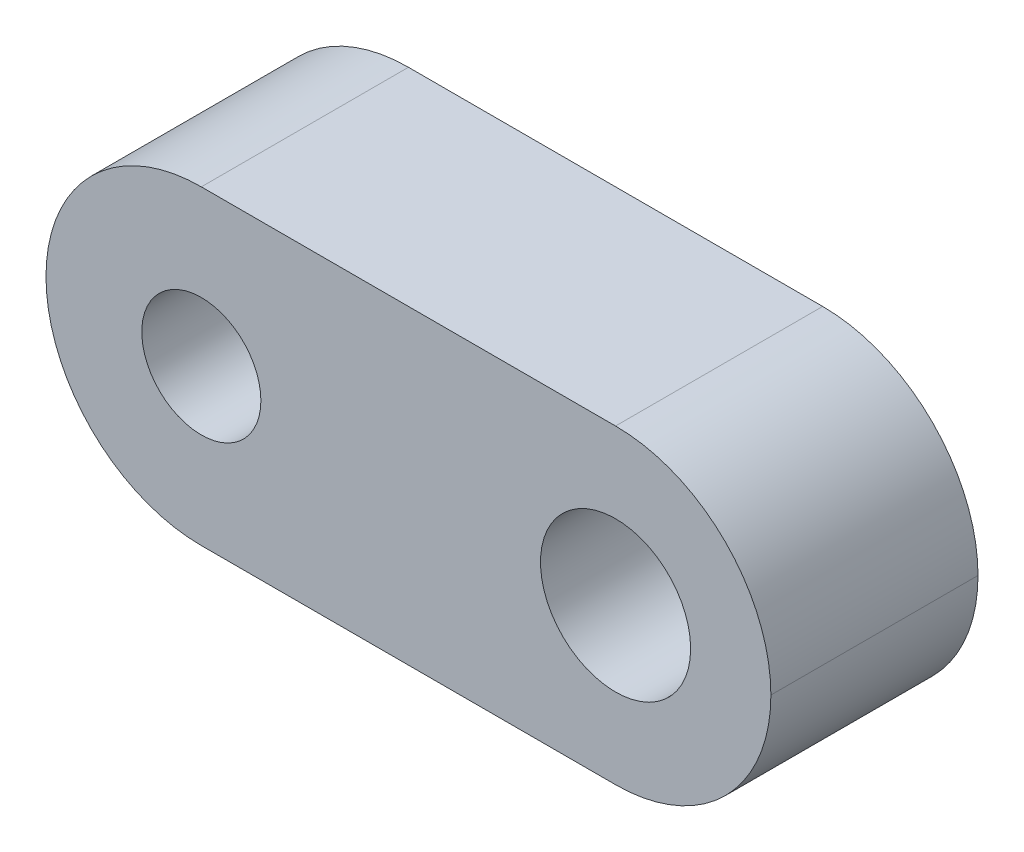
ISO-10303-21;
HEADER;
FILE_DESCRIPTION(('STEP AP214'),'2;1');
FILE_NAME('part.step','',(''),(''),'','','');
FILE_SCHEMA(('AUTOMOTIVE_DESIGN { 1 0 10303 214 1 1 1 1 }'));
ENDSEC;
DATA;
#1=APPLICATION_CONTEXT('core data for automotive mechanical design processes');
#2=APPLICATION_PROTOCOL_DEFINITION('international standard','automotive_design',2000,#1);
#3=PRODUCT_CONTEXT('',#1,'mechanical');
#4=PRODUCT('Part','Part','',(#3));
#5=PRODUCT_RELATED_PRODUCT_CATEGORY('part','',(#4));
#6=PRODUCT_DEFINITION_FORMATION('','',#4);
#7=PRODUCT_DEFINITION_CONTEXT('part definition',#1,'design');
#8=PRODUCT_DEFINITION('design','',#6,#7);
#9=PRODUCT_DEFINITION_SHAPE('','',#8);
#10=(LENGTH_UNIT() NAMED_UNIT(*) SI_UNIT(.MILLI.,.METRE.));
#11=(NAMED_UNIT(*) PLANE_ANGLE_UNIT() SI_UNIT($,.RADIAN.));
#12=(NAMED_UNIT(*) SI_UNIT($,.STERADIAN.) SOLID_ANGLE_UNIT());
#13=UNCERTAINTY_MEASURE_WITH_UNIT(LENGTH_MEASURE(1.E-05),#10,'distance_accuracy_value','');
#14=(GEOMETRIC_REPRESENTATION_CONTEXT(3) GLOBAL_UNCERTAINTY_ASSIGNED_CONTEXT((#13)) GLOBAL_UNIT_ASSIGNED_CONTEXT((#10,
#11,#12)) REPRESENTATION_CONTEXT('',''));
#15=CARTESIAN_POINT('',(0.,0.,0.));
#16=DIRECTION('',(0.,0.,1.));
#17=DIRECTION('',(1.,0.,0.));
#18=AXIS2_PLACEMENT_3D('',#15,#16,#17);
#19=CARTESIAN_POINT('',(0.,-6.,4.));
#20=DIRECTION('',(0.,1.,0.));
#21=DIRECTION('',(0.,0.,1.));
#22=AXIS2_PLACEMENT_3D('',#19,#20,#21);
#23=PLANE('',#22);
#24=DIRECTION('',(1.,0.,0.));
#25=VECTOR('',#24,1.);
#26=CARTESIAN_POINT('',(0.,-6.,0.));
#27=LINE('',#26,#25);
#28=CARTESIAN_POINT('',(3.,-6.,0.));
#29=VERTEX_POINT('',#28);
#30=CARTESIAN_POINT('',(11.,-6.,0.));
#31=VERTEX_POINT('',#30);
#32=EDGE_CURVE('E92',#29,#31,#27,.T.);
#33=ORIENTED_EDGE('',*,*,#32,.T.);
#34=DIRECTION('',(0.,0.,-1.));
#35=VECTOR('',#34,1.);
#36=CARTESIAN_POINT('',(11.,-6.,4.));
#37=LINE('',#36,#35);
#38=CARTESIAN_POINT('',(11.,-6.,4.));
#39=VERTEX_POINT('',#38);
#40=EDGE_CURVE('E124',#31,#39,#37,.F.);
#41=ORIENTED_EDGE('',*,*,#40,.T.);
#42=DIRECTION('',(1.,0.,0.));
#43=VECTOR('',#42,1.);
#44=CARTESIAN_POINT('',(0.,-6.,4.));
#45=LINE('',#44,#43);
#46=CARTESIAN_POINT('',(3.,-6.,4.));
#47=VERTEX_POINT('',#46);
#48=EDGE_CURVE('E134',#47,#39,#45,.T.);
#49=ORIENTED_EDGE('',*,*,#48,.F.);
#50=DIRECTION('',(0.,0.,-1.));
#51=VECTOR('',#50,1.);
#52=CARTESIAN_POINT('',(3.,-6.,4.));
#53=LINE('',#52,#51);
#54=EDGE_CURVE('E127',#47,#29,#53,.T.);
#55=ORIENTED_EDGE('',*,*,#54,.T.);
#56=EDGE_LOOP('',(#33,#41,#49,#55));
#57=FACE_BOUND('',#56,.T.);
#58=ADVANCED_FACE('F33',(#57),#23,.F.);
#59=CARTESIAN_POINT('',(0.,0.,4.));
#60=DIRECTION('',(0.,-1.,0.));
#61=DIRECTION('',(0.,0.,-1.));
#62=AXIS2_PLACEMENT_3D('',#59,#60,#61);
#63=PLANE('',#62);
#64=DIRECTION('',(-1.,0.,0.));
#65=VECTOR('',#64,1.);
#66=CARTESIAN_POINT('',(0.,0.,4.));
#67=LINE('',#66,#65);
#68=CARTESIAN_POINT('',(11.,0.,4.));
#69=VERTEX_POINT('',#68);
#70=CARTESIAN_POINT('',(3.,0.,4.));
#71=VERTEX_POINT('',#70);
#72=EDGE_CURVE('E103',#69,#71,#67,.T.);
#73=ORIENTED_EDGE('',*,*,#72,.F.);
#74=DIRECTION('',(0.,0.,-1.));
#75=VECTOR('',#74,1.);
#76=CARTESIAN_POINT('',(11.,0.,4.));
#77=LINE('',#76,#75);
#78=CARTESIAN_POINT('',(11.,0.,0.));
#79=VERTEX_POINT('',#78);
#80=EDGE_CURVE('E11',#69,#79,#77,.T.);
#81=ORIENTED_EDGE('',*,*,#80,.T.);
#82=DIRECTION('',(-1.,0.,0.));
#83=VECTOR('',#82,1.);
#84=CARTESIAN_POINT('',(0.,0.,0.));
#85=LINE('',#84,#83);
#86=CARTESIAN_POINT('',(3.,0.,0.));
#87=VERTEX_POINT('',#86);
#88=EDGE_CURVE('E132',#79,#87,#85,.T.);
#89=ORIENTED_EDGE('',*,*,#88,.T.);
#90=DIRECTION('',(0.,0.,-1.));
#91=VECTOR('',#90,1.);
#92=CARTESIAN_POINT('',(3.,0.,4.));
#93=LINE('',#92,#91);
#94=EDGE_CURVE('E42',#87,#71,#93,.F.);
#95=ORIENTED_EDGE('',*,*,#94,.T.);
#96=EDGE_LOOP('',(#73,#81,#89,#95));
#97=FACE_BOUND('',#96,.T.);
#98=ADVANCED_FACE('F154',(#97),#63,.F.);
#99=CARTESIAN_POINT('',(0.,0.,4.));
#100=DIRECTION('',(0.,0.,1.));
#101=DIRECTION('',(1.,0.,0.));
#102=AXIS2_PLACEMENT_3D('',#99,#100,#101);
#103=PLANE('',#102);
#104=CARTESIAN_POINT('',(11.,-3.,4.));
#105=DIRECTION('',(0.,0.,1.));
#106=DIRECTION('',(1.,0.,0.));
#107=AXIS2_PLACEMENT_3D('',#104,#105,#106);
#108=CIRCLE('',#107,1.45);
#109=CARTESIAN_POINT('',(12.45,-3.,4.));
#110=VERTEX_POINT('',#109);
#111=EDGE_CURVE('E114',#110,#110,#108,.T.);
#112=ORIENTED_EDGE('',*,*,#111,.F.);
#113=EDGE_LOOP('',(#112));
#114=FACE_BOUND('',#113,.T.);
#115=CARTESIAN_POINT('',(3.,-3.,4.));
#116=DIRECTION('',(0.,0.,1.));
#117=DIRECTION('',(1.,0.,0.));
#118=AXIS2_PLACEMENT_3D('',#115,#116,#117);
#119=CIRCLE('',#118,1.15);
#120=CARTESIAN_POINT('',(4.15,-3.,4.));
#121=VERTEX_POINT('',#120);
#122=EDGE_CURVE('E136',#121,#121,#119,.T.);
#123=ORIENTED_EDGE('',*,*,#122,.F.);
#124=EDGE_LOOP('',(#123));
#125=FACE_BOUND('',#124,.T.);
#126=ORIENTED_EDGE('',*,*,#48,.T.);
#127=CARTESIAN_POINT('',(11.,-3.,4.));
#128=DIRECTION('',(0.,0.,1.));
#129=DIRECTION('',(1.,0.,0.));
#130=AXIS2_PLACEMENT_3D('',#127,#128,#129);
#131=CIRCLE('',#130,3.);
#132=CARTESIAN_POINT('',(14.,-3.,4.));
#133=VERTEX_POINT('',#132);
#134=EDGE_CURVE('E118',#39,#133,#131,.T.);
#135=ORIENTED_EDGE('',*,*,#134,.T.);
#136=CARTESIAN_POINT('',(11.,-3.,4.));
#137=DIRECTION('',(0.,0.,1.));
#138=DIRECTION('',(1.,0.,0.));
#139=AXIS2_PLACEMENT_3D('',#136,#137,#138);
#140=CIRCLE('',#139,3.);
#141=EDGE_CURVE('E56',#133,#69,#140,.T.);
#142=ORIENTED_EDGE('',*,*,#141,.T.);
#143=ORIENTED_EDGE('',*,*,#72,.T.);
#144=CARTESIAN_POINT('',(3.,-3.,4.));
#145=DIRECTION('',(0.,0.,1.));
#146=DIRECTION('',(1.,0.,0.));
#147=AXIS2_PLACEMENT_3D('',#144,#145,#146);
#148=CIRCLE('',#147,3.);
#149=CARTESIAN_POINT('',(0.,-3.,4.));
#150=VERTEX_POINT('',#149);
#151=EDGE_CURVE('E122',#71,#150,#148,.T.);
#152=ORIENTED_EDGE('',*,*,#151,.T.);
#153=CARTESIAN_POINT('',(3.,-3.,4.));
#154=DIRECTION('',(0.,0.,1.));
#155=DIRECTION('',(1.,0.,0.));
#156=AXIS2_PLACEMENT_3D('',#153,#154,#155);
#157=CIRCLE('',#156,3.);
#158=EDGE_CURVE('E106',#150,#47,#157,.T.);
#159=ORIENTED_EDGE('',*,*,#158,.T.);
#160=EDGE_LOOP('',(#126,#135,#142,#143,#152,#159));
#161=FACE_BOUND('',#160,.T.);
#162=ADVANCED_FACE('F151',(#114,#125,#161),#103,.T.);
#163=CARTESIAN_POINT('',(0.,0.,0.));
#164=DIRECTION('',(0.,0.,1.));
#165=DIRECTION('',(1.,0.,0.));
#166=AXIS2_PLACEMENT_3D('',#163,#164,#165);
#167=PLANE('',#166);
#168=CARTESIAN_POINT('',(11.,-3.,0.));
#169=DIRECTION('',(0.,0.,1.));
#170=DIRECTION('',(1.,0.,0.));
#171=AXIS2_PLACEMENT_3D('',#168,#169,#170);
#172=CIRCLE('',#171,1.45);
#173=CARTESIAN_POINT('',(12.45,-3.,0.));
#174=VERTEX_POINT('',#173);
#175=EDGE_CURVE('E109',#174,#174,#172,.T.);
#176=ORIENTED_EDGE('',*,*,#175,.T.);
#177=EDGE_LOOP('',(#176));
#178=FACE_BOUND('',#177,.T.);
#179=CARTESIAN_POINT('',(3.,-3.,0.));
#180=DIRECTION('',(0.,0.,1.));
#181=DIRECTION('',(1.,0.,0.));
#182=AXIS2_PLACEMENT_3D('',#179,#180,#181);
#183=CIRCLE('',#182,1.15);
#184=CARTESIAN_POINT('',(4.15,-3.,0.));
#185=VERTEX_POINT('',#184);
#186=EDGE_CURVE('E142',#185,#185,#183,.T.);
#187=ORIENTED_EDGE('',*,*,#186,.T.);
#188=EDGE_LOOP('',(#187));
#189=FACE_BOUND('',#188,.T.);
#190=CARTESIAN_POINT('',(11.,-3.,0.));
#191=DIRECTION('',(0.,0.,1.));
#192=DIRECTION('',(1.,0.,0.));
#193=AXIS2_PLACEMENT_3D('',#190,#191,#192);
#194=CIRCLE('',#193,3.);
#195=CARTESIAN_POINT('',(14.,-3.,0.));
#196=VERTEX_POINT('',#195);
#197=EDGE_CURVE('E97',#79,#196,#194,.F.);
#198=ORIENTED_EDGE('',*,*,#197,.T.);
#199=CARTESIAN_POINT('',(11.,-3.,0.));
#200=DIRECTION('',(0.,0.,1.));
#201=DIRECTION('',(1.,0.,0.));
#202=AXIS2_PLACEMENT_3D('',#199,#200,#201);
#203=CIRCLE('',#202,3.);
#204=EDGE_CURVE('E129',#196,#31,#203,.F.);
#205=ORIENTED_EDGE('',*,*,#204,.T.);
#206=ORIENTED_EDGE('',*,*,#32,.F.);
#207=CARTESIAN_POINT('',(3.,-3.,0.));
#208=DIRECTION('',(0.,0.,1.));
#209=DIRECTION('',(1.,0.,0.));
#210=AXIS2_PLACEMENT_3D('',#207,#208,#209);
#211=CIRCLE('',#210,3.);
#212=CARTESIAN_POINT('',(0.,-3.,0.));
#213=VERTEX_POINT('',#212);
#214=EDGE_CURVE('E86',#29,#213,#211,.F.);
#215=ORIENTED_EDGE('',*,*,#214,.T.);
#216=CARTESIAN_POINT('',(3.,-3.,0.));
#217=DIRECTION('',(0.,0.,1.));
#218=DIRECTION('',(1.,0.,0.));
#219=AXIS2_PLACEMENT_3D('',#216,#217,#218);
#220=CIRCLE('',#219,3.);
#221=EDGE_CURVE('E90',#213,#87,#220,.F.);
#222=ORIENTED_EDGE('',*,*,#221,.T.);
#223=ORIENTED_EDGE('',*,*,#88,.F.);
#224=EDGE_LOOP('',(#198,#205,#206,#215,#222,#223));
#225=FACE_BOUND('',#224,.T.);
#226=ADVANCED_FACE('F88',(#178,#189,#225),#167,.F.);
#227=CARTESIAN_POINT('',(3.,-3.,0.));
#228=DIRECTION('',(0.,0.,1.));
#229=DIRECTION('',(1.,0.,0.));
#230=AXIS2_PLACEMENT_3D('',#227,#228,#229);
#231=CYLINDRICAL_SURFACE('',#230,1.15);
#232=ORIENTED_EDGE('',*,*,#122,.T.);
#233=EDGE_LOOP('',(#232));
#234=FACE_BOUND('',#233,.T.);
#235=ORIENTED_EDGE('',*,*,#186,.F.);
#236=EDGE_LOOP('',(#235));
#237=FACE_BOUND('',#236,.T.);
#238=ADVANCED_FACE('F197',(#234,#237),#231,.F.);
#239=CARTESIAN_POINT('',(11.,-3.,0.));
#240=DIRECTION('',(0.,0.,1.));
#241=DIRECTION('',(1.,0.,0.));
#242=AXIS2_PLACEMENT_3D('',#239,#240,#241);
#243=CYLINDRICAL_SURFACE('',#242,1.45);
#244=ORIENTED_EDGE('',*,*,#111,.T.);
#245=EDGE_LOOP('',(#244));
#246=FACE_BOUND('',#245,.T.);
#247=ORIENTED_EDGE('',*,*,#175,.F.);
#248=EDGE_LOOP('',(#247));
#249=FACE_BOUND('',#248,.T.);
#250=ADVANCED_FACE('F148',(#246,#249),#243,.F.);
#251=CARTESIAN_POINT('',(11.,-3.,4.));
#252=DIRECTION('',(0.,0.,-1.));
#253=DIRECTION('',(-1.,0.,0.));
#254=AXIS2_PLACEMENT_3D('',#251,#252,#253);
#255=CYLINDRICAL_SURFACE('',#254,3.);
#256=ORIENTED_EDGE('',*,*,#80,.F.);
#257=ORIENTED_EDGE('',*,*,#141,.F.);
#258=DIRECTION('',(0.,0.,-1.));
#259=VECTOR('',#258,1.);
#260=CARTESIAN_POINT('',(14.,-3.,4.));
#261=LINE('',#260,#259);
#262=EDGE_CURVE('E107',#196,#133,#261,.F.);
#263=ORIENTED_EDGE('',*,*,#262,.F.);
#264=ORIENTED_EDGE('',*,*,#197,.F.);
#265=EDGE_LOOP('',(#256,#257,#263,#264));
#266=FACE_BOUND('',#265,.T.);
#267=ADVANCED_FACE('F164',(#266),#255,.T.);
#268=CARTESIAN_POINT('',(11.,-3.,4.));
#269=DIRECTION('',(0.,0.,-1.));
#270=DIRECTION('',(-1.,0.,0.));
#271=AXIS2_PLACEMENT_3D('',#268,#269,#270);
#272=CYLINDRICAL_SURFACE('',#271,3.);
#273=ORIENTED_EDGE('',*,*,#134,.F.);
#274=ORIENTED_EDGE('',*,*,#40,.F.);
#275=ORIENTED_EDGE('',*,*,#204,.F.);
#276=ORIENTED_EDGE('',*,*,#262,.T.);
#277=EDGE_LOOP('',(#273,#274,#275,#276));
#278=FACE_BOUND('',#277,.T.);
#279=ADVANCED_FACE('F160',(#278),#272,.T.);
#280=CARTESIAN_POINT('',(3.,-3.,4.));
#281=DIRECTION('',(0.,0.,-1.));
#282=DIRECTION('',(-1.,0.,0.));
#283=AXIS2_PLACEMENT_3D('',#280,#281,#282);
#284=CYLINDRICAL_SURFACE('',#283,3.);
#285=DIRECTION('',(0.,0.,-1.));
#286=VECTOR('',#285,1.);
#287=CARTESIAN_POINT('',(0.,-3.,4.));
#288=LINE('',#287,#286);
#289=EDGE_CURVE('E37',#150,#213,#288,.T.);
#290=ORIENTED_EDGE('',*,*,#289,.F.);
#291=ORIENTED_EDGE('',*,*,#151,.F.);
#292=ORIENTED_EDGE('',*,*,#94,.F.);
#293=ORIENTED_EDGE('',*,*,#221,.F.);
#294=EDGE_LOOP('',(#290,#291,#292,#293));
#295=FACE_BOUND('',#294,.T.);
#296=ADVANCED_FACE('F35',(#295),#284,.T.);
#297=CARTESIAN_POINT('',(3.,-3.,4.));
#298=DIRECTION('',(0.,0.,-1.));
#299=DIRECTION('',(-1.,0.,0.));
#300=AXIS2_PLACEMENT_3D('',#297,#298,#299);
#301=CYLINDRICAL_SURFACE('',#300,3.);
#302=ORIENTED_EDGE('',*,*,#158,.F.);
#303=ORIENTED_EDGE('',*,*,#289,.T.);
#304=ORIENTED_EDGE('',*,*,#214,.F.);
#305=ORIENTED_EDGE('',*,*,#54,.F.);
#306=EDGE_LOOP('',(#302,#303,#304,#305));
#307=FACE_BOUND('',#306,.T.);
#308=ADVANCED_FACE('F105',(#307),#301,.T.);
#309=CLOSED_SHELL('',(#58,#98,#162,#226,#238,#250,#267,#279,#296,#308));
#310=MANIFOLD_SOLID_BREP('B2',#309);
#311=ADVANCED_BREP_SHAPE_REPRESENTATION('',(#18,#310),#14);
#312=SHAPE_DEFINITION_REPRESENTATION(#9,#311);
ENDSEC;
END-ISO-10303-21;
